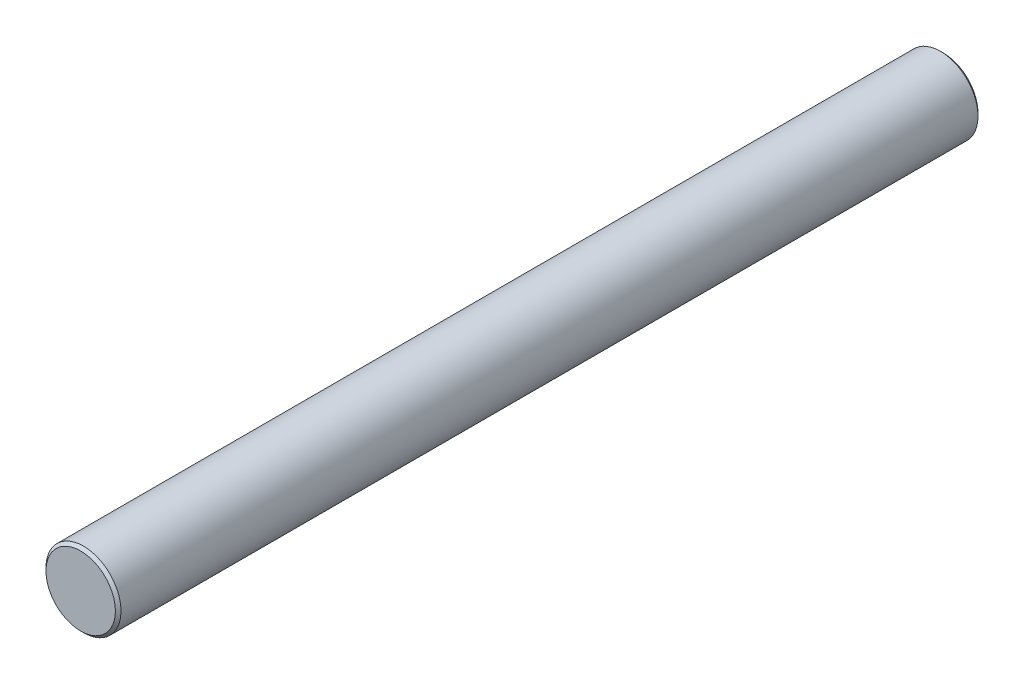
ISO-10303-21;
HEADER;
FILE_DESCRIPTION(('STEP AP214'),'2;1');
FILE_NAME('part.step','',(''),(''),'','','');
FILE_SCHEMA(('AUTOMOTIVE_DESIGN { 1 0 10303 214 1 1 1 1 }'));
ENDSEC;
DATA;
#1=APPLICATION_CONTEXT('core data for automotive mechanical design processes');
#2=APPLICATION_PROTOCOL_DEFINITION('international standard','automotive_design',2000,#1);
#3=PRODUCT_CONTEXT('',#1,'mechanical');
#4=PRODUCT('Part','Part','',(#3));
#5=PRODUCT_RELATED_PRODUCT_CATEGORY('part','',(#4));
#6=PRODUCT_DEFINITION_FORMATION('','',#4);
#7=PRODUCT_DEFINITION_CONTEXT('part definition',#1,'design');
#8=PRODUCT_DEFINITION('design','',#6,#7);
#9=PRODUCT_DEFINITION_SHAPE('','',#8);
#10=(LENGTH_UNIT() NAMED_UNIT(*) SI_UNIT(.MILLI.,.METRE.));
#11=(NAMED_UNIT(*) PLANE_ANGLE_UNIT() SI_UNIT($,.RADIAN.));
#12=(NAMED_UNIT(*) SI_UNIT($,.STERADIAN.) SOLID_ANGLE_UNIT());
#13=UNCERTAINTY_MEASURE_WITH_UNIT(LENGTH_MEASURE(1.E-05),#10,'distance_accuracy_value','');
#14=(GEOMETRIC_REPRESENTATION_CONTEXT(3) GLOBAL_UNCERTAINTY_ASSIGNED_CONTEXT((#13)) GLOBAL_UNIT_ASSIGNED_CONTEXT((#10,
#11,#12)) REPRESENTATION_CONTEXT('',''));
#15=CARTESIAN_POINT('',(0.,0.,0.));
#16=DIRECTION('',(0.,0.,1.));
#17=DIRECTION('',(1.,0.,0.));
#18=AXIS2_PLACEMENT_3D('',#15,#16,#17);
#19=CARTESIAN_POINT('',(0.,9.25,0.));
#20=DIRECTION('',(0.,0.,-1.));
#21=DIRECTION('',(0.,1.,0.));
#22=AXIS2_PLACEMENT_3D('',#19,#20,#21);
#23=PLANE('',#22);
#24=CARTESIAN_POINT('',(0.,0.,0.));
#25=DIRECTION('',(0.,0.,-1.));
#26=DIRECTION('',(0.,1.,0.));
#27=AXIS2_PLACEMENT_3D('',#24,#25,#26);
#28=CIRCLE('',#27,18.5);
#29=CARTESIAN_POINT('',(0.,18.5,0.));
#30=VERTEX_POINT('',#29);
#31=EDGE_CURVE('E9',#30,#30,#28,.T.);
#32=ORIENTED_EDGE('',*,*,#31,.T.);
#33=EDGE_LOOP('',(#32));
#34=FACE_BOUND('',#33,.T.);
#35=CARTESIAN_POINT('',(0.,0.,0.));
#36=DIRECTION('',(0.,0.,1.));
#37=DIRECTION('',(-1.,0.,0.));
#38=AXIS2_PLACEMENT_3D('',#35,#36,#37);
#39=CIRCLE('',#38,6.);
#40=CARTESIAN_POINT('',(-6.,0.,0.));
#41=VERTEX_POINT('',#40);
#42=EDGE_CURVE('E52',#41,#41,#39,.T.);
#43=ORIENTED_EDGE('',*,*,#42,.T.);
#44=EDGE_LOOP('',(#43));
#45=FACE_BOUND('',#44,.T.);
#46=ADVANCED_FACE('F15',(#34,#45),#23,.T.);
#47=CARTESIAN_POINT('',(0.,0.,0.75));
#48=DIRECTION('',(0.,0.,1.));
#49=DIRECTION('',(0.,1.,0.));
#50=AXIS2_PLACEMENT_3D('',#47,#48,#49);
#51=CONICAL_SURFACE('',#50,19.25,0.785398163397448);
#52=CARTESIAN_POINT('',(0.,0.,1.5));
#53=DIRECTION('',(0.,0.,-1.));
#54=DIRECTION('',(0.,1.,0.));
#55=AXIS2_PLACEMENT_3D('',#52,#53,#54);
#56=CIRCLE('',#55,20.);
#57=CARTESIAN_POINT('',(0.,20.,1.5));
#58=VERTEX_POINT('',#57);
#59=EDGE_CURVE('E25',#58,#58,#56,.T.);
#60=ORIENTED_EDGE('',*,*,#59,.T.);
#61=EDGE_LOOP('',(#60));
#62=FACE_BOUND('',#61,.T.);
#63=ORIENTED_EDGE('',*,*,#31,.F.);
#64=EDGE_LOOP('',(#63));
#65=FACE_BOUND('',#64,.T.);
#66=ADVANCED_FACE('F121',(#62,#65),#51,.T.);
#67=CARTESIAN_POINT('',(0.,0.,230.));
#68=DIRECTION('',(0.,0.,1.));
#69=DIRECTION('',(0.,1.,0.));
#70=AXIS2_PLACEMENT_3D('',#67,#68,#69);
#71=CYLINDRICAL_SURFACE('',#70,20.);
#72=CARTESIAN_POINT('',(0.,0.,458.5));
#73=DIRECTION('',(0.,0.,-1.));
#74=DIRECTION('',(0.,1.,0.));
#75=AXIS2_PLACEMENT_3D('',#72,#73,#74);
#76=CIRCLE('',#75,20.);
#77=CARTESIAN_POINT('',(0.,20.,458.5));
#78=VERTEX_POINT('',#77);
#79=EDGE_CURVE('E19',#78,#78,#76,.T.);
#80=ORIENTED_EDGE('',*,*,#79,.T.);
#81=EDGE_LOOP('',(#80));
#82=FACE_BOUND('',#81,.T.);
#83=ORIENTED_EDGE('',*,*,#59,.F.);
#84=EDGE_LOOP('',(#83));
#85=FACE_BOUND('',#84,.T.);
#86=CARTESIAN_POINT('',(0.,0.,6.5));
#87=DIRECTION('',(0.,0.,-1.));
#88=DIRECTION('',(0.,1.,0.));
#89=AXIS2_PLACEMENT_3D('',#86,#87,#88);
#90=CIRCLE('',#89,20.);
#91=CARTESIAN_POINT('',(10.5356537528527,-17.,6.5));
#92=VERTEX_POINT('',#91);
#93=CARTESIAN_POINT('',(-10.5356537528527,-17.,6.5));
#94=VERTEX_POINT('',#93);
#95=EDGE_CURVE('E69',#92,#94,#90,.T.);
#96=ORIENTED_EDGE('',*,*,#95,.T.);
#97=DIRECTION('',(0.,0.,1.));
#98=VECTOR('',#97,1.);
#99=CARTESIAN_POINT('',(-10.5356537528527,-17.,8.25));
#100=LINE('',#99,#98);
#101=CARTESIAN_POINT('',(-10.5356537528527,-17.,10.));
#102=VERTEX_POINT('',#101);
#103=EDGE_CURVE('E62',#94,#102,#100,.T.);
#104=ORIENTED_EDGE('',*,*,#103,.T.);
#105=CARTESIAN_POINT('',(0.,0.,10.));
#106=DIRECTION('',(0.,0.,1.));
#107=DIRECTION('',(0.,1.,0.));
#108=AXIS2_PLACEMENT_3D('',#105,#106,#107);
#109=CIRCLE('',#108,20.);
#110=CARTESIAN_POINT('',(10.5356537528527,-17.,10.));
#111=VERTEX_POINT('',#110);
#112=EDGE_CURVE('E75',#102,#111,#109,.T.);
#113=ORIENTED_EDGE('',*,*,#112,.T.);
#114=DIRECTION('',(0.,0.,-1.));
#115=VECTOR('',#114,1.);
#116=CARTESIAN_POINT('',(10.5356537528527,-17.,8.25));
#117=LINE('',#116,#115);
#118=EDGE_CURVE('E60',#111,#92,#117,.T.);
#119=ORIENTED_EDGE('',*,*,#118,.T.);
#120=EDGE_LOOP('',(#96,#104,#113,#119));
#121=FACE_BOUND('',#120,.T.);
#122=ADVANCED_FACE('F17',(#82,#85,#121),#71,.T.);
#123=CARTESIAN_POINT('',(0.,0.,459.25));
#124=DIRECTION('',(0.,0.,-1.));
#125=DIRECTION('',(0.,1.,0.));
#126=AXIS2_PLACEMENT_3D('',#123,#124,#125);
#127=CONICAL_SURFACE('',#126,19.25,0.785398163397448);
#128=CARTESIAN_POINT('',(0.,0.,460.));
#129=DIRECTION('',(0.,0.,-1.));
#130=DIRECTION('',(0.,1.,0.));
#131=AXIS2_PLACEMENT_3D('',#128,#129,#130);
#132=CIRCLE('',#131,18.5);
#133=CARTESIAN_POINT('',(0.,18.5,460.));
#134=VERTEX_POINT('',#133);
#135=EDGE_CURVE('E44',#134,#134,#132,.T.);
#136=ORIENTED_EDGE('',*,*,#135,.T.);
#137=EDGE_LOOP('',(#136));
#138=FACE_BOUND('',#137,.T.);
#139=ORIENTED_EDGE('',*,*,#79,.F.);
#140=EDGE_LOOP('',(#139));
#141=FACE_BOUND('',#140,.T.);
#142=ADVANCED_FACE('F116',(#138,#141),#127,.T.);
#143=CARTESIAN_POINT('',(0.,9.25,460.));
#144=DIRECTION('',(0.,0.,1.));
#145=DIRECTION('',(0.,-1.,0.));
#146=AXIS2_PLACEMENT_3D('',#143,#144,#145);
#147=PLANE('',#146);
#148=ORIENTED_EDGE('',*,*,#135,.F.);
#149=EDGE_LOOP('',(#148));
#150=FACE_BOUND('',#149,.T.);
#151=ADVANCED_FACE('F110',(#150),#147,.T.);
#152=CARTESIAN_POINT('',(0.,0.,26.4586213285198));
#153=DIRECTION('',(0.,0.,-1.));
#154=DIRECTION('',(-1.,0.,0.));
#155=AXIS2_PLACEMENT_3D('',#152,#153,#154);
#156=CONICAL_SURFACE('',#155,2.52640625,1.0471975511966);
#157=CARTESIAN_POINT('',(0.,0.,25.));
#158=DIRECTION('',(0.,0.,1.));
#159=DIRECTION('',(-1.,0.,0.));
#160=AXIS2_PLACEMENT_3D('',#157,#158,#159);
#161=CIRCLE('',#160,5.0528125);
#162=CARTESIAN_POINT('',(-5.0528125,0.,25.));
#163=VERTEX_POINT('',#162);
#164=EDGE_CURVE('E51',#163,#163,#161,.T.);
#165=ORIENTED_EDGE('',*,*,#164,.F.);
#166=EDGE_LOOP('',(#165));
#167=FACE_BOUND('',#166,.T.);
#168=CARTESIAN_POINT('',(0.,0.,27.9172426570397));
#169=VERTEX_POINT('',#168);
#170=VERTEX_LOOP('',#169);
#171=FACE_BOUND('',#170,.T.);
#172=ADVANCED_FACE('F104',(#167,#171),#156,.F.);
#173=CARTESIAN_POINT('',(0.,0.,12.97359375));
#174=DIRECTION('',(0.,0.,-1.));
#175=DIRECTION('',(-1.,0.,0.));
#176=AXIS2_PLACEMENT_3D('',#173,#174,#175);
#177=CYLINDRICAL_SURFACE('',#176,5.0528125);
#178=CARTESIAN_POINT('',(0.,0.,0.9471875));
#179=DIRECTION('',(0.,0.,1.));
#180=DIRECTION('',(-1.,0.,0.));
#181=AXIS2_PLACEMENT_3D('',#178,#179,#180);
#182=CIRCLE('',#181,5.0528125);
#183=CARTESIAN_POINT('',(-5.0528125,0.,0.9471875));
#184=VERTEX_POINT('',#183);
#185=EDGE_CURVE('E57',#184,#184,#182,.T.);
#186=ORIENTED_EDGE('',*,*,#185,.F.);
#187=EDGE_LOOP('',(#186));
#188=FACE_BOUND('',#187,.T.);
#189=ORIENTED_EDGE('',*,*,#164,.T.);
#190=EDGE_LOOP('',(#189));
#191=FACE_BOUND('',#190,.T.);
#192=ADVANCED_FACE('F101',(#188,#191),#177,.F.);
#193=CARTESIAN_POINT('',(0.,0.,0.47359375));
#194=DIRECTION('',(0.,0.,-1.));
#195=DIRECTION('',(-1.,0.,0.));
#196=AXIS2_PLACEMENT_3D('',#193,#194,#195);
#197=CONICAL_SURFACE('',#196,5.52640625,0.785398163397448);
#198=ORIENTED_EDGE('',*,*,#42,.F.);
#199=EDGE_LOOP('',(#198));
#200=FACE_BOUND('',#199,.T.);
#201=ORIENTED_EDGE('',*,*,#185,.T.);
#202=EDGE_LOOP('',(#201));
#203=FACE_BOUND('',#202,.T.);
#204=ADVANCED_FACE('F99',(#200,#203),#197,.F.);
#205=CARTESIAN_POINT('',(0.,-17.,8.25));
#206=DIRECTION('',(0.,-1.,0.));
#207=DIRECTION('',(0.,0.,-1.));
#208=AXIS2_PLACEMENT_3D('',#205,#206,#207);
#209=PLANE('',#208);
#210=ORIENTED_EDGE('',*,*,#103,.F.);
#211=DIRECTION('',(1.,0.,0.));
#212=VECTOR('',#211,1.);
#213=CARTESIAN_POINT('',(0.,-17.,6.5));
#214=LINE('',#213,#212);
#215=EDGE_CURVE('E66',#94,#92,#214,.T.);
#216=ORIENTED_EDGE('',*,*,#215,.T.);
#217=ORIENTED_EDGE('',*,*,#118,.F.);
#218=DIRECTION('',(-1.,0.,0.));
#219=VECTOR('',#218,1.);
#220=CARTESIAN_POINT('',(0.,-17.,10.));
#221=LINE('',#220,#219);
#222=EDGE_CURVE('E72',#111,#102,#221,.T.);
#223=ORIENTED_EDGE('',*,*,#222,.T.);
#224=EDGE_LOOP('',(#210,#216,#217,#223));
#225=FACE_BOUND('',#224,.T.);
#226=ADVANCED_FACE('F131',(#225),#209,.T.);
#227=CARTESIAN_POINT('',(0.,-19.5,6.5));
#228=DIRECTION('',(0.,0.,1.));
#229=DIRECTION('',(1.,0.,0.));
#230=AXIS2_PLACEMENT_3D('',#227,#228,#229);
#231=PLANE('',#230);
#232=ORIENTED_EDGE('',*,*,#95,.F.);
#233=ORIENTED_EDGE('',*,*,#215,.F.);
#234=EDGE_LOOP('',(#232,#233));
#235=FACE_BOUND('',#234,.T.);
#236=ADVANCED_FACE('F135',(#235),#231,.T.);
#237=CARTESIAN_POINT('',(0.,-19.5,10.));
#238=DIRECTION('',(0.,0.,1.));
#239=DIRECTION('',(1.,0.,0.));
#240=AXIS2_PLACEMENT_3D('',#237,#238,#239);
#241=PLANE('',#240);
#242=ORIENTED_EDGE('',*,*,#112,.F.);
#243=ORIENTED_EDGE('',*,*,#222,.F.);
#244=EDGE_LOOP('',(#242,#243));
#245=FACE_BOUND('',#244,.T.);
#246=ADVANCED_FACE('F87',(#245),#241,.F.);
#247=CLOSED_SHELL('',(#46,#66,#122,#142,#151,#172,#192,#204,#226,#236,#246));
#248=MANIFOLD_SOLID_BREP('B1',#247);
#249=ADVANCED_BREP_SHAPE_REPRESENTATION('',(#18,#248),#14);
#250=SHAPE_DEFINITION_REPRESENTATION(#9,#249);
ENDSEC;
END-ISO-10303-21;
